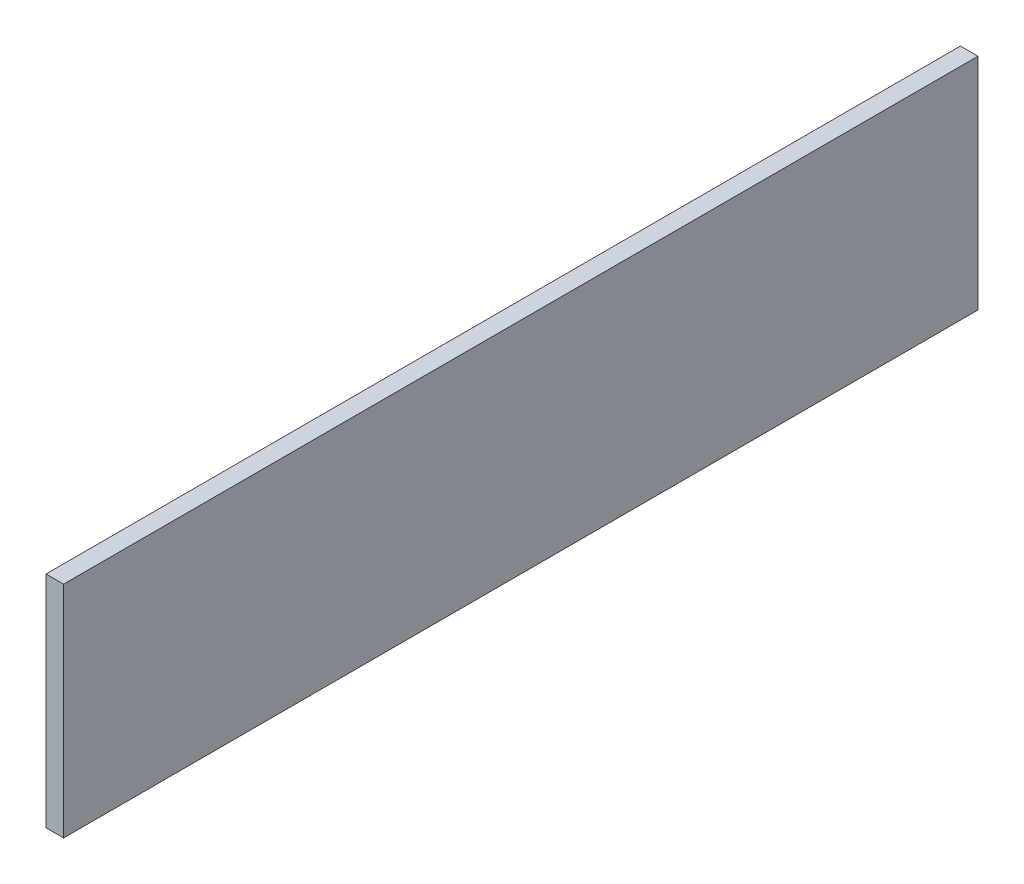
ISO-10303-21;
HEADER;
FILE_DESCRIPTION(('STEP AP214'),'2;1');
FILE_NAME('part.step','',(''),(''),'','','');
FILE_SCHEMA(('AUTOMOTIVE_DESIGN { 1 0 10303 214 1 1 1 1 }'));
ENDSEC;
DATA;
#1=APPLICATION_CONTEXT('core data for automotive mechanical design processes');
#2=APPLICATION_PROTOCOL_DEFINITION('international standard','automotive_design',2000,#1);
#3=PRODUCT_CONTEXT('',#1,'mechanical');
#4=PRODUCT('Part','Part','',(#3));
#5=PRODUCT_RELATED_PRODUCT_CATEGORY('part','',(#4));
#6=PRODUCT_DEFINITION_FORMATION('','',#4);
#7=PRODUCT_DEFINITION_CONTEXT('part definition',#1,'design');
#8=PRODUCT_DEFINITION('design','',#6,#7);
#9=PRODUCT_DEFINITION_SHAPE('','',#8);
#10=(LENGTH_UNIT() NAMED_UNIT(*) SI_UNIT(.MILLI.,.METRE.));
#11=(NAMED_UNIT(*) PLANE_ANGLE_UNIT() SI_UNIT($,.RADIAN.));
#12=(NAMED_UNIT(*) SI_UNIT($,.STERADIAN.) SOLID_ANGLE_UNIT());
#13=UNCERTAINTY_MEASURE_WITH_UNIT(LENGTH_MEASURE(1.E-05),#10,'distance_accuracy_value','');
#14=(GEOMETRIC_REPRESENTATION_CONTEXT(3) GLOBAL_UNCERTAINTY_ASSIGNED_CONTEXT((#13)) GLOBAL_UNIT_ASSIGNED_CONTEXT((#10,
#11,#12)) REPRESENTATION_CONTEXT('',''));
#15=CARTESIAN_POINT('',(0.,0.,0.));
#16=DIRECTION('',(0.,0.,1.));
#17=DIRECTION('',(1.,0.,0.));
#18=AXIS2_PLACEMENT_3D('',#15,#16,#17);
#19=CARTESIAN_POINT('',(-79.9999999999999,2000.,4160.));
#20=DIRECTION('',(1.,0.,0.));
#21=DIRECTION('',(0.,0.,-1.));
#22=AXIS2_PLACEMENT_3D('',#19,#20,#21);
#23=PLANE('',#22);
#24=DIRECTION('',(0.,0.,1.));
#25=VECTOR('',#24,1.);
#26=CARTESIAN_POINT('',(-79.9999999999999,0.,4160.));
#27=LINE('',#26,#25);
#28=CARTESIAN_POINT('',(-80.,0.,-4160.));
#29=VERTEX_POINT('',#28);
#30=CARTESIAN_POINT('',(-79.9999999999999,0.,4160.));
#31=VERTEX_POINT('',#30);
#32=EDGE_CURVE('E100',#29,#31,#27,.T.);
#33=ORIENTED_EDGE('',*,*,#32,.T.);
#34=DIRECTION('',(0.,-1.,0.));
#35=VECTOR('',#34,1.);
#36=CARTESIAN_POINT('',(-79.9999999999999,2000.,4160.));
#37=LINE('',#36,#35);
#38=CARTESIAN_POINT('',(-79.9999999999999,2000.,4160.));
#39=VERTEX_POINT('',#38);
#40=EDGE_CURVE('E11',#39,#31,#37,.T.);
#41=ORIENTED_EDGE('',*,*,#40,.F.);
#42=DIRECTION('',(0.,0.,1.));
#43=VECTOR('',#42,1.);
#44=CARTESIAN_POINT('',(-79.9999999999999,2000.,4160.));
#45=LINE('',#44,#43);
#46=CARTESIAN_POINT('',(-80.,2000.,-4160.));
#47=VERTEX_POINT('',#46);
#48=EDGE_CURVE('E88',#47,#39,#45,.T.);
#49=ORIENTED_EDGE('',*,*,#48,.F.);
#50=DIRECTION('',(0.,-1.,0.));
#51=VECTOR('',#50,1.);
#52=CARTESIAN_POINT('',(-80.,2000.,-4160.));
#53=LINE('',#52,#51);
#54=EDGE_CURVE('E96',#47,#29,#53,.T.);
#55=ORIENTED_EDGE('',*,*,#54,.T.);
#56=EDGE_LOOP('',(#33,#41,#49,#55));
#57=FACE_BOUND('',#56,.T.);
#58=ADVANCED_FACE('F37',(#57),#23,.F.);
#59=CARTESIAN_POINT('',(80.,2000.,4160.));
#60=DIRECTION('',(0.,0.,-1.));
#61=DIRECTION('',(-1.,0.,0.));
#62=AXIS2_PLACEMENT_3D('',#59,#60,#61);
#63=PLANE('',#62);
#64=DIRECTION('',(1.,0.,0.));
#65=VECTOR('',#64,1.);
#66=CARTESIAN_POINT('',(80.,0.,4160.));
#67=LINE('',#66,#65);
#68=CARTESIAN_POINT('',(80.,0.,4160.));
#69=VERTEX_POINT('',#68);
#70=EDGE_CURVE('E92',#31,#69,#67,.T.);
#71=ORIENTED_EDGE('',*,*,#70,.T.);
#72=DIRECTION('',(0.,-1.,0.));
#73=VECTOR('',#72,1.);
#74=CARTESIAN_POINT('',(80.,2000.,4160.));
#75=LINE('',#74,#73);
#76=CARTESIAN_POINT('',(80.,2000.,4160.));
#77=VERTEX_POINT('',#76);
#78=EDGE_CURVE('E45',#77,#69,#75,.T.);
#79=ORIENTED_EDGE('',*,*,#78,.F.);
#80=DIRECTION('',(1.,0.,0.));
#81=VECTOR('',#80,1.);
#82=CARTESIAN_POINT('',(80.,2000.,4160.));
#83=LINE('',#82,#81);
#84=EDGE_CURVE('E83',#39,#77,#83,.T.);
#85=ORIENTED_EDGE('',*,*,#84,.F.);
#86=ORIENTED_EDGE('',*,*,#40,.T.);
#87=EDGE_LOOP('',(#71,#79,#85,#86));
#88=FACE_BOUND('',#87,.T.);
#89=ADVANCED_FACE('F91',(#88),#63,.F.);
#90=CARTESIAN_POINT('',(80.,2000.,4160.));
#91=DIRECTION('',(-1.,0.,0.));
#92=DIRECTION('',(0.,0.,1.));
#93=AXIS2_PLACEMENT_3D('',#90,#91,#92);
#94=PLANE('',#93);
#95=DIRECTION('',(0.,0.,-1.));
#96=VECTOR('',#95,1.);
#97=CARTESIAN_POINT('',(80.,0.,4160.));
#98=LINE('',#97,#96);
#99=CARTESIAN_POINT('',(80.,0.,-4160.));
#100=VERTEX_POINT('',#99);
#101=EDGE_CURVE('E70',#69,#100,#98,.T.);
#102=ORIENTED_EDGE('',*,*,#101,.T.);
#103=DIRECTION('',(0.,-1.,0.));
#104=VECTOR('',#103,1.);
#105=CARTESIAN_POINT('',(80.,2000.,-4160.));
#106=LINE('',#105,#104);
#107=CARTESIAN_POINT('',(80.,2000.,-4160.));
#108=VERTEX_POINT('',#107);
#109=EDGE_CURVE('E93',#108,#100,#106,.T.);
#110=ORIENTED_EDGE('',*,*,#109,.F.);
#111=DIRECTION('',(0.,0.,-1.));
#112=VECTOR('',#111,1.);
#113=CARTESIAN_POINT('',(80.,2000.,4160.));
#114=LINE('',#113,#112);
#115=EDGE_CURVE('E86',#77,#108,#114,.T.);
#116=ORIENTED_EDGE('',*,*,#115,.F.);
#117=ORIENTED_EDGE('',*,*,#78,.T.);
#118=EDGE_LOOP('',(#102,#110,#116,#117));
#119=FACE_BOUND('',#118,.T.);
#120=ADVANCED_FACE('F94',(#119),#94,.F.);
#121=CARTESIAN_POINT('',(80.,2000.,-4160.));
#122=DIRECTION('',(0.,0.,1.));
#123=DIRECTION('',(1.,0.,0.));
#124=AXIS2_PLACEMENT_3D('',#121,#122,#123);
#125=PLANE('',#124);
#126=DIRECTION('',(-1.,0.,0.));
#127=VECTOR('',#126,1.);
#128=CARTESIAN_POINT('',(80.,0.,-4160.));
#129=LINE('',#128,#127);
#130=EDGE_CURVE('E76',#100,#29,#129,.T.);
#131=ORIENTED_EDGE('',*,*,#130,.T.);
#132=ORIENTED_EDGE('',*,*,#54,.F.);
#133=DIRECTION('',(-1.,0.,0.));
#134=VECTOR('',#133,1.);
#135=CARTESIAN_POINT('',(80.,2000.,-4160.));
#136=LINE('',#135,#134);
#137=EDGE_CURVE('E53',#108,#47,#136,.T.);
#138=ORIENTED_EDGE('',*,*,#137,.F.);
#139=ORIENTED_EDGE('',*,*,#109,.T.);
#140=EDGE_LOOP('',(#131,#132,#138,#139));
#141=FACE_BOUND('',#140,.T.);
#142=ADVANCED_FACE('F107',(#141),#125,.F.);
#143=CARTESIAN_POINT('',(0.,2000.,0.));
#144=DIRECTION('',(0.,1.,0.));
#145=DIRECTION('',(0.,0.,1.));
#146=AXIS2_PLACEMENT_3D('',#143,#144,#145);
#147=PLANE('',#146);
#148=ORIENTED_EDGE('',*,*,#48,.T.);
#149=ORIENTED_EDGE('',*,*,#84,.T.);
#150=ORIENTED_EDGE('',*,*,#115,.T.);
#151=ORIENTED_EDGE('',*,*,#137,.T.);
#152=EDGE_LOOP('',(#148,#149,#150,#151));
#153=FACE_BOUND('',#152,.T.);
#154=ADVANCED_FACE('F84',(#153),#147,.T.);
#155=CARTESIAN_POINT('',(0.,0.,0.));
#156=DIRECTION('',(0.,1.,0.));
#157=DIRECTION('',(0.,0.,1.));
#158=AXIS2_PLACEMENT_3D('',#155,#156,#157);
#159=PLANE('',#158);
#160=ORIENTED_EDGE('',*,*,#32,.F.);
#161=ORIENTED_EDGE('',*,*,#130,.F.);
#162=ORIENTED_EDGE('',*,*,#101,.F.);
#163=ORIENTED_EDGE('',*,*,#70,.F.);
#164=EDGE_LOOP('',(#160,#161,#162,#163));
#165=FACE_BOUND('',#164,.T.);
#166=ADVANCED_FACE('F110',(#165),#159,.F.);
#167=CLOSED_SHELL('',(#58,#89,#120,#142,#154,#166));
#168=MANIFOLD_SOLID_BREP('B2',#167);
#169=ADVANCED_BREP_SHAPE_REPRESENTATION('',(#18,#168),#14);
#170=SHAPE_DEFINITION_REPRESENTATION(#9,#169);
ENDSEC;
END-ISO-10303-21;
